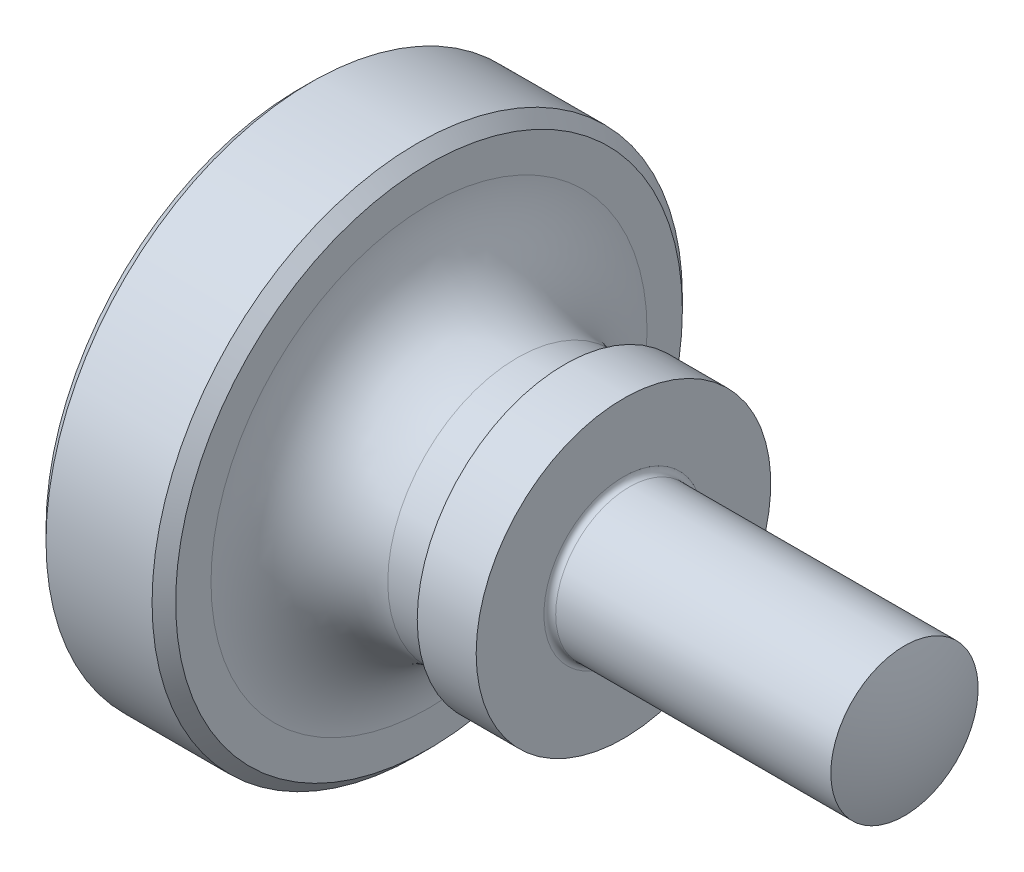
ISO-10303-21;
HEADER;
FILE_DESCRIPTION(('STEP AP214'),'2;1');
FILE_NAME('part.step','',(''),(''),'','','');
FILE_SCHEMA(('AUTOMOTIVE_DESIGN { 1 0 10303 214 1 1 1 1 }'));
ENDSEC;
DATA;
#1=APPLICATION_CONTEXT('core data for automotive mechanical design processes');
#2=APPLICATION_PROTOCOL_DEFINITION('international standard','automotive_design',2000,#1);
#3=PRODUCT_CONTEXT('',#1,'mechanical');
#4=PRODUCT('Part','Part','',(#3));
#5=PRODUCT_RELATED_PRODUCT_CATEGORY('part','',(#4));
#6=PRODUCT_DEFINITION_FORMATION('','',#4);
#7=PRODUCT_DEFINITION_CONTEXT('part definition',#1,'design');
#8=PRODUCT_DEFINITION('design','',#6,#7);
#9=PRODUCT_DEFINITION_SHAPE('','',#8);
#10=(LENGTH_UNIT() NAMED_UNIT(*) SI_UNIT(.MILLI.,.METRE.));
#11=(NAMED_UNIT(*) PLANE_ANGLE_UNIT() SI_UNIT($,.RADIAN.));
#12=(NAMED_UNIT(*) SI_UNIT($,.STERADIAN.) SOLID_ANGLE_UNIT());
#13=UNCERTAINTY_MEASURE_WITH_UNIT(LENGTH_MEASURE(1.E-05),#10,'distance_accuracy_value','');
#14=(GEOMETRIC_REPRESENTATION_CONTEXT(3) GLOBAL_UNCERTAINTY_ASSIGNED_CONTEXT((#13)) GLOBAL_UNIT_ASSIGNED_CONTEXT((#10,
#11,#12)) REPRESENTATION_CONTEXT('',''));
#15=CARTESIAN_POINT('',(0.,0.,0.));
#16=DIRECTION('',(0.,0.,1.));
#17=DIRECTION('',(1.,0.,0.));
#18=AXIS2_PLACEMENT_3D('',#15,#16,#17);
#19=CARTESIAN_POINT('',(0.,0.,0.));
#20=DIRECTION('',(1.,0.,0.));
#21=DIRECTION('',(0.,0.,-1.));
#22=AXIS2_PLACEMENT_3D('',#19,#20,#21);
#23=CONICAL_SURFACE('',#22,4.3,0.785398163397447);
#24=CARTESIAN_POINT('',(0.,0.,0.));
#25=DIRECTION('',(-1.,0.,0.));
#26=DIRECTION('',(0.,0.,1.));
#27=AXIS2_PLACEMENT_3D('',#24,#25,#26);
#28=CIRCLE('',#27,4.3);
#29=CARTESIAN_POINT('',(0.,0.,4.3));
#30=VERTEX_POINT('',#29);
#31=EDGE_CURVE('E112',#30,#30,#28,.T.);
#32=ORIENTED_EDGE('',*,*,#31,.F.);
#33=EDGE_LOOP('',(#32));
#34=FACE_BOUND('',#33,.T.);
#35=CARTESIAN_POINT('',(0.2,0.,0.));
#36=DIRECTION('',(1.,0.,0.));
#37=DIRECTION('',(0.,0.,1.));
#38=AXIS2_PLACEMENT_3D('',#35,#36,#37);
#39=CIRCLE('',#38,4.5);
#40=CARTESIAN_POINT('',(0.2,0.,4.5));
#41=VERTEX_POINT('',#40);
#42=EDGE_CURVE('E104',#41,#41,#39,.T.);
#43=ORIENTED_EDGE('',*,*,#42,.F.);
#44=EDGE_LOOP('',(#43));
#45=FACE_BOUND('',#44,.T.);
#46=ADVANCED_FACE('F15',(#34,#45),#23,.T.);
#47=CARTESIAN_POINT('',(2.,0.,0.));
#48=DIRECTION('',(-1.,0.,0.));
#49=DIRECTION('',(0.,0.,1.));
#50=AXIS2_PLACEMENT_3D('',#47,#48,#49);
#51=CONICAL_SURFACE('',#50,4.5,0.785398163397447);
#52=CARTESIAN_POINT('',(2.,0.,0.));
#53=DIRECTION('',(-1.,0.,0.));
#54=DIRECTION('',(0.,0.,-1.));
#55=AXIS2_PLACEMENT_3D('',#52,#53,#54);
#56=CIRCLE('',#55,4.5);
#57=CARTESIAN_POINT('',(2.,0.,-4.5));
#58=VERTEX_POINT('',#57);
#59=EDGE_CURVE('E107',#58,#58,#56,.T.);
#60=ORIENTED_EDGE('',*,*,#59,.F.);
#61=EDGE_LOOP('',(#60));
#62=FACE_BOUND('',#61,.T.);
#63=CARTESIAN_POINT('',(2.2,0.,0.));
#64=DIRECTION('',(1.,0.,0.));
#65=DIRECTION('',(0.,0.,-1.));
#66=AXIS2_PLACEMENT_3D('',#63,#64,#65);
#67=CIRCLE('',#66,4.3);
#68=CARTESIAN_POINT('',(2.2,0.,-4.3));
#69=VERTEX_POINT('',#68);
#70=EDGE_CURVE('E99',#69,#69,#67,.T.);
#71=ORIENTED_EDGE('',*,*,#70,.F.);
#72=EDGE_LOOP('',(#71));
#73=FACE_BOUND('',#72,.T.);
#74=ADVANCED_FACE('F121',(#62,#73),#51,.T.);
#75=CARTESIAN_POINT('',(5.6,0.,0.));
#76=DIRECTION('',(1.,0.,0.));
#77=DIRECTION('',(0.,0.,-1.));
#78=AXIS2_PLACEMENT_3D('',#75,#76,#77);
#79=TOROIDAL_SURFACE('',#78,1.35,0.1);
#80=CARTESIAN_POINT('',(5.5,0.,0.));
#81=DIRECTION('',(-1.,0.,0.));
#82=DIRECTION('',(0.,0.,-1.));
#83=AXIS2_PLACEMENT_3D('',#80,#81,#82);
#84=CIRCLE('',#83,1.35);
#85=CARTESIAN_POINT('',(5.5,0.,-1.35));
#86=VERTEX_POINT('',#85);
#87=EDGE_CURVE('E18',#86,#86,#84,.T.);
#88=ORIENTED_EDGE('',*,*,#87,.F.);
#89=EDGE_LOOP('',(#88));
#90=FACE_BOUND('',#89,.T.);
#91=CARTESIAN_POINT('',(5.6,0.,0.));
#92=DIRECTION('',(1.,0.,0.));
#93=DIRECTION('',(0.,0.,-1.));
#94=AXIS2_PLACEMENT_3D('',#91,#92,#93);
#95=CIRCLE('',#94,1.25);
#96=CARTESIAN_POINT('',(5.6,0.,-1.25));
#97=VERTEX_POINT('',#96);
#98=EDGE_CURVE('E24',#97,#97,#95,.T.);
#99=ORIENTED_EDGE('',*,*,#98,.F.);
#100=EDGE_LOOP('',(#99));
#101=FACE_BOUND('',#100,.T.);
#102=ADVANCED_FACE('F133',(#90,#101),#79,.F.);
#103=CARTESIAN_POINT('',(3.7,0.,0.));
#104=DIRECTION('',(1.,0.,0.));
#105=DIRECTION('',(0.,0.,-1.));
#106=AXIS2_PLACEMENT_3D('',#103,#104,#105);
#107=TOROIDAL_SURFACE('',#106,3.7,1.5);
#108=CARTESIAN_POINT('',(2.2,0.,0.));
#109=DIRECTION('',(-1.,0.,0.));
#110=DIRECTION('',(0.,0.,-1.));
#111=AXIS2_PLACEMENT_3D('',#108,#109,#110);
#112=CIRCLE('',#111,3.7);
#113=CARTESIAN_POINT('',(2.2,0.,-3.7));
#114=VERTEX_POINT('',#113);
#115=EDGE_CURVE('E96',#114,#114,#112,.T.);
#116=ORIENTED_EDGE('',*,*,#115,.F.);
#117=EDGE_LOOP('',(#116));
#118=FACE_BOUND('',#117,.T.);
#119=CARTESIAN_POINT('',(3.7,0.,0.));
#120=DIRECTION('',(1.,0.,0.));
#121=DIRECTION('',(0.,0.,-1.));
#122=AXIS2_PLACEMENT_3D('',#119,#120,#121);
#123=CIRCLE('',#122,2.2);
#124=CARTESIAN_POINT('',(3.7,0.,-2.2));
#125=VERTEX_POINT('',#124);
#126=EDGE_CURVE('E93',#125,#125,#123,.T.);
#127=ORIENTED_EDGE('',*,*,#126,.F.);
#128=EDGE_LOOP('',(#127));
#129=FACE_BOUND('',#128,.T.);
#130=ADVANCED_FACE('F152',(#118,#129),#107,.F.);
#131=CARTESIAN_POINT('',(7.,0.,0.));
#132=DIRECTION('',(-1.,0.,0.));
#133=DIRECTION('',(0.,0.,1.));
#134=AXIS2_PLACEMENT_3D('',#131,#132,#133);
#135=SPHERICAL_SURFACE('',#134,3.5);
#136=CARTESIAN_POINT('',(10.2691742076555,0.,0.));
#137=DIRECTION('',(-1.,0.,0.));
#138=DIRECTION('',(0.,0.,1.));
#139=AXIS2_PLACEMENT_3D('',#136,#137,#138);
#140=CIRCLE('',#139,1.25);
#141=CARTESIAN_POINT('',(10.2691742076555,0.,1.25));
#142=VERTEX_POINT('',#141);
#143=EDGE_CURVE('E10',#142,#142,#140,.T.);
#144=ORIENTED_EDGE('',*,*,#143,.F.);
#145=EDGE_LOOP('',(#144));
#146=FACE_BOUND('',#145,.T.);
#147=ADVANCED_FACE('F155',(#146),#135,.T.);
#148=CARTESIAN_POINT('',(0.,0.,0.));
#149=DIRECTION('',(-1.,0.,0.));
#150=DIRECTION('',(0.,0.,1.));
#151=AXIS2_PLACEMENT_3D('',#148,#149,#150);
#152=CYLINDRICAL_SURFACE('',#151,1.25);
#153=ORIENTED_EDGE('',*,*,#143,.T.);
#154=EDGE_LOOP('',(#153));
#155=FACE_BOUND('',#154,.T.);
#156=ORIENTED_EDGE('',*,*,#98,.T.);
#157=EDGE_LOOP('',(#156));
#158=FACE_BOUND('',#157,.T.);
#159=ADVANCED_FACE('F157',(#155,#158),#152,.T.);
#160=CARTESIAN_POINT('',(5.5,0.,2.5));
#161=DIRECTION('',(1.,0.,0.));
#162=DIRECTION('',(0.,1.,0.));
#163=AXIS2_PLACEMENT_3D('',#160,#161,#162);
#164=PLANE('',#163);
#165=CARTESIAN_POINT('',(5.5,0.,0.));
#166=DIRECTION('',(-1.,0.,0.));
#167=DIRECTION('',(0.,0.,1.));
#168=AXIS2_PLACEMENT_3D('',#165,#166,#167);
#169=CIRCLE('',#168,2.5);
#170=CARTESIAN_POINT('',(5.5,0.,2.5));
#171=VERTEX_POINT('',#170);
#172=EDGE_CURVE('E81',#171,#171,#169,.T.);
#173=ORIENTED_EDGE('',*,*,#172,.F.);
#174=EDGE_LOOP('',(#173));
#175=FACE_BOUND('',#174,.T.);
#176=ORIENTED_EDGE('',*,*,#87,.T.);
#177=EDGE_LOOP('',(#176));
#178=FACE_BOUND('',#177,.T.);
#179=ADVANCED_FACE('F160',(#175,#178),#164,.T.);
#180=CARTESIAN_POINT('',(0.,0.,0.));
#181=DIRECTION('',(-1.,0.,0.));
#182=DIRECTION('',(0.,0.,1.));
#183=AXIS2_PLACEMENT_3D('',#180,#181,#182);
#184=CYLINDRICAL_SURFACE('',#183,2.5);
#185=CARTESIAN_POINT('',(4.5,0.,0.));
#186=DIRECTION('',(-1.,0.,0.));
#187=DIRECTION('',(0.,0.,1.));
#188=AXIS2_PLACEMENT_3D('',#185,#186,#187);
#189=CIRCLE('',#188,2.5);
#190=CARTESIAN_POINT('',(4.5,0.,2.5));
#191=VERTEX_POINT('',#190);
#192=EDGE_CURVE('E85',#191,#191,#189,.T.);
#193=ORIENTED_EDGE('',*,*,#192,.F.);
#194=EDGE_LOOP('',(#193));
#195=FACE_BOUND('',#194,.T.);
#196=ORIENTED_EDGE('',*,*,#172,.T.);
#197=EDGE_LOOP('',(#196));
#198=FACE_BOUND('',#197,.T.);
#199=ADVANCED_FACE('F82',(#195,#198),#184,.T.);
#200=CARTESIAN_POINT('',(4.5,0.,2.2));
#201=DIRECTION('',(-1.,0.,0.));
#202=DIRECTION('',(0.,0.,1.));
#203=AXIS2_PLACEMENT_3D('',#200,#201,#202);
#204=PLANE('',#203);
#205=CARTESIAN_POINT('',(4.5,0.,0.));
#206=DIRECTION('',(-1.,0.,0.));
#207=DIRECTION('',(0.,0.,1.));
#208=AXIS2_PLACEMENT_3D('',#205,#206,#207);
#209=CIRCLE('',#208,2.2);
#210=CARTESIAN_POINT('',(4.5,0.,2.2));
#211=VERTEX_POINT('',#210);
#212=EDGE_CURVE('E90',#211,#211,#209,.T.);
#213=ORIENTED_EDGE('',*,*,#212,.F.);
#214=EDGE_LOOP('',(#213));
#215=FACE_BOUND('',#214,.T.);
#216=ORIENTED_EDGE('',*,*,#192,.T.);
#217=EDGE_LOOP('',(#216));
#218=FACE_BOUND('',#217,.T.);
#219=ADVANCED_FACE('F144',(#215,#218),#204,.T.);
#220=CARTESIAN_POINT('',(0.,0.,0.));
#221=DIRECTION('',(-1.,0.,0.));
#222=DIRECTION('',(0.,0.,1.));
#223=AXIS2_PLACEMENT_3D('',#220,#221,#222);
#224=CYLINDRICAL_SURFACE('',#223,2.2);
#225=ORIENTED_EDGE('',*,*,#212,.T.);
#226=EDGE_LOOP('',(#225));
#227=FACE_BOUND('',#226,.T.);
#228=ORIENTED_EDGE('',*,*,#126,.T.);
#229=EDGE_LOOP('',(#228));
#230=FACE_BOUND('',#229,.T.);
#231=ADVANCED_FACE('F137',(#227,#230),#224,.T.);
#232=CARTESIAN_POINT('',(2.2,0.,4.5));
#233=DIRECTION('',(1.,0.,0.));
#234=DIRECTION('',(0.,1.,0.));
#235=AXIS2_PLACEMENT_3D('',#232,#233,#234);
#236=PLANE('',#235);
#237=ORIENTED_EDGE('',*,*,#115,.T.);
#238=EDGE_LOOP('',(#237));
#239=FACE_BOUND('',#238,.T.);
#240=ORIENTED_EDGE('',*,*,#70,.T.);
#241=EDGE_LOOP('',(#240));
#242=FACE_BOUND('',#241,.T.);
#243=ADVANCED_FACE('F127',(#239,#242),#236,.T.);
#244=CARTESIAN_POINT('',(0.,0.,0.));
#245=DIRECTION('',(-1.,0.,0.));
#246=DIRECTION('',(0.,0.,1.));
#247=AXIS2_PLACEMENT_3D('',#244,#245,#246);
#248=CYLINDRICAL_SURFACE('',#247,4.5);
#249=ORIENTED_EDGE('',*,*,#42,.T.);
#250=EDGE_LOOP('',(#249));
#251=FACE_BOUND('',#250,.T.);
#252=ORIENTED_EDGE('',*,*,#59,.T.);
#253=EDGE_LOOP('',(#252));
#254=FACE_BOUND('',#253,.T.);
#255=ADVANCED_FACE('F124',(#251,#254),#248,.T.);
#256=CARTESIAN_POINT('',(0.,0.,0.));
#257=DIRECTION('',(-1.,0.,0.));
#258=DIRECTION('',(0.,0.,1.));
#259=AXIS2_PLACEMENT_3D('',#256,#257,#258);
#260=PLANE('',#259);
#261=ORIENTED_EDGE('',*,*,#31,.T.);
#262=EDGE_LOOP('',(#261));
#263=FACE_BOUND('',#262,.T.);
#264=ADVANCED_FACE('F117',(#263),#260,.T.);
#265=CLOSED_SHELL('',(#46,#74,#102,#130,#147,#159,#179,#199,#219,#231,#243,#255,#264));
#266=MANIFOLD_SOLID_BREP('B1',#265);
#267=ADVANCED_BREP_SHAPE_REPRESENTATION('',(#18,#266),#14);
#268=SHAPE_DEFINITION_REPRESENTATION(#9,#267);
ENDSEC;
END-ISO-10303-21;
